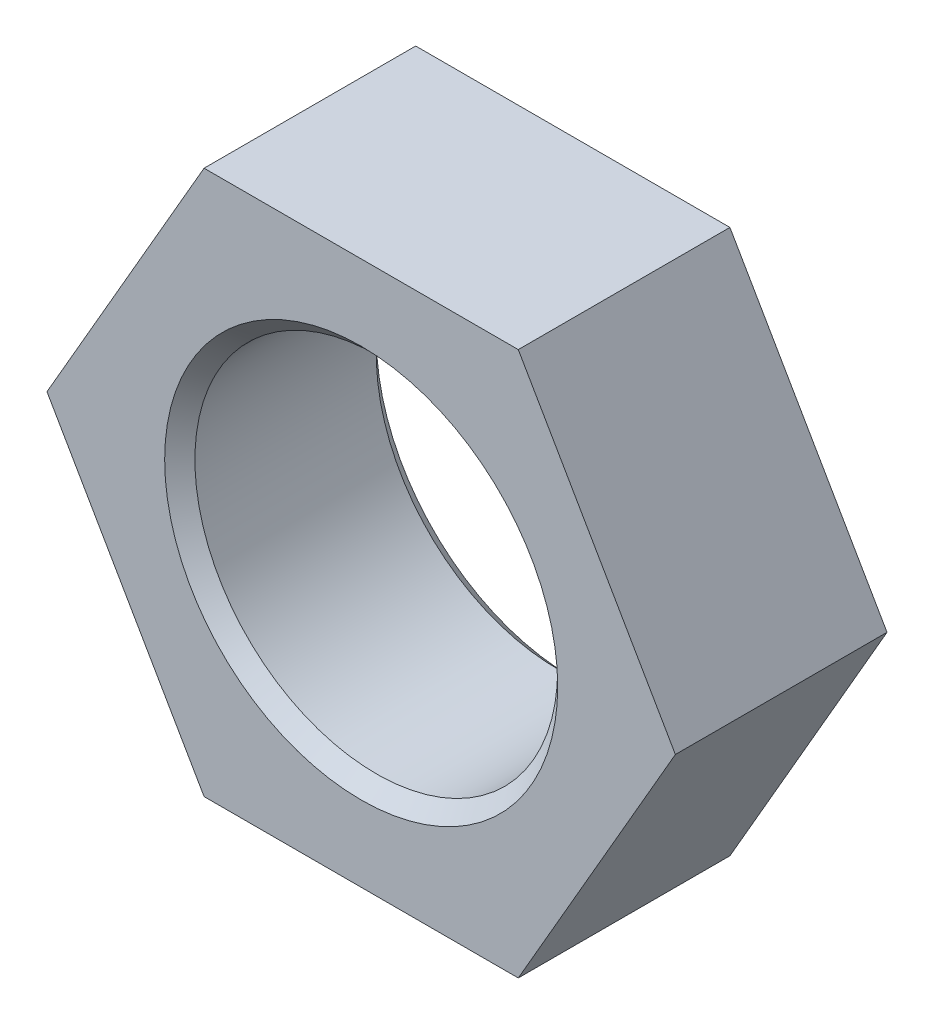
ISO-10303-21;
HEADER;
FILE_DESCRIPTION(('STEP AP214'),'2;1');
FILE_NAME('part.step','',(''),(''),'','','');
FILE_SCHEMA(('AUTOMOTIVE_DESIGN { 1 0 10303 214 1 1 1 1 }'));
ENDSEC;
DATA;
#1=APPLICATION_CONTEXT('core data for automotive mechanical design processes');
#2=APPLICATION_PROTOCOL_DEFINITION('international standard','automotive_design',2000,#1);
#3=PRODUCT_CONTEXT('',#1,'mechanical');
#4=PRODUCT('Part','Part','',(#3));
#5=PRODUCT_RELATED_PRODUCT_CATEGORY('part','',(#4));
#6=PRODUCT_DEFINITION_FORMATION('','',#4);
#7=PRODUCT_DEFINITION_CONTEXT('part definition',#1,'design');
#8=PRODUCT_DEFINITION('design','',#6,#7);
#9=PRODUCT_DEFINITION_SHAPE('','',#8);
#10=(LENGTH_UNIT() NAMED_UNIT(*) SI_UNIT(.MILLI.,.METRE.));
#11=(NAMED_UNIT(*) PLANE_ANGLE_UNIT() SI_UNIT($,.RADIAN.));
#12=(NAMED_UNIT(*) SI_UNIT($,.STERADIAN.) SOLID_ANGLE_UNIT());
#13=UNCERTAINTY_MEASURE_WITH_UNIT(LENGTH_MEASURE(1.E-05),#10,'distance_accuracy_value','');
#14=(GEOMETRIC_REPRESENTATION_CONTEXT(3) GLOBAL_UNCERTAINTY_ASSIGNED_CONTEXT((#13)) GLOBAL_UNIT_ASSIGNED_CONTEXT((#10,
#11,#12)) REPRESENTATION_CONTEXT('',''));
#15=CARTESIAN_POINT('',(0.,0.,0.));
#16=DIRECTION('',(0.,0.,1.));
#17=DIRECTION('',(1.,0.,0.));
#18=AXIS2_PLACEMENT_3D('',#15,#16,#17);
#19=CARTESIAN_POINT('',(0.,0.,3.5));
#20=DIRECTION('',(0.,0.,1.));
#21=DIRECTION('',(1.,0.,0.));
#22=AXIS2_PLACEMENT_3D('',#19,#20,#21);
#23=PLANE('',#22);
#24=CARTESIAN_POINT('',(0.,0.,3.5));
#25=DIRECTION('',(0.,0.,1.));
#26=DIRECTION('',(1.,0.,0.));
#27=AXIS2_PLACEMENT_3D('',#24,#25,#26);
#28=CIRCLE('',#27,3.25);
#29=CARTESIAN_POINT('',(3.25,0.,3.5));
#30=VERTEX_POINT('',#29);
#31=EDGE_CURVE('E11',#30,#30,#28,.F.);
#32=ORIENTED_EDGE('',*,*,#31,.T.);
#33=EDGE_LOOP('',(#32));
#34=FACE_BOUND('',#33,.T.);
#35=DIRECTION('',(0.499999999999999,0.866025403784439,0.));
#36=VECTOR('',#35,1.);
#37=CARTESIAN_POINT('',(2.59807621135332,-4.5,3.5));
#38=LINE('',#37,#36);
#39=CARTESIAN_POINT('',(2.59807621135332,-4.5,3.5));
#40=VERTEX_POINT('',#39);
#41=CARTESIAN_POINT('',(5.19615242270663,0.,3.5));
#42=VERTEX_POINT('',#41);
#43=EDGE_CURVE('E132',#40,#42,#38,.T.);
#44=ORIENTED_EDGE('',*,*,#43,.T.);
#45=DIRECTION('',(-0.5,0.866025403784438,0.));
#46=VECTOR('',#45,1.);
#47=CARTESIAN_POINT('',(5.19615242270663,0.,3.5));
#48=LINE('',#47,#46);
#49=CARTESIAN_POINT('',(2.59807621135332,4.5,3.5));
#50=VERTEX_POINT('',#49);
#51=EDGE_CURVE('E92',#42,#50,#48,.T.);
#52=ORIENTED_EDGE('',*,*,#51,.T.);
#53=DIRECTION('',(-1.,0.,0.));
#54=VECTOR('',#53,1.);
#55=CARTESIAN_POINT('',(2.59807621135332,4.5,3.5));
#56=LINE('',#55,#54);
#57=CARTESIAN_POINT('',(-2.59807621135332,4.5,3.5));
#58=VERTEX_POINT('',#57);
#59=EDGE_CURVE('E104',#50,#58,#56,.T.);
#60=ORIENTED_EDGE('',*,*,#59,.T.);
#61=DIRECTION('',(-0.5,-0.866025403784439,0.));
#62=VECTOR('',#61,1.);
#63=CARTESIAN_POINT('',(-2.59807621135332,4.5,3.5));
#64=LINE('',#63,#62);
#65=CARTESIAN_POINT('',(-5.19615242270663,0.,3.5));
#66=VERTEX_POINT('',#65);
#67=EDGE_CURVE('E99',#58,#66,#64,.T.);
#68=ORIENTED_EDGE('',*,*,#67,.T.);
#69=DIRECTION('',(0.5,-0.866025403784438,0.));
#70=VECTOR('',#69,1.);
#71=CARTESIAN_POINT('',(-5.19615242270663,0.,3.5));
#72=LINE('',#71,#70);
#73=CARTESIAN_POINT('',(-2.59807621135332,-4.5,3.5));
#74=VERTEX_POINT('',#73);
#75=EDGE_CURVE('E102',#66,#74,#72,.T.);
#76=ORIENTED_EDGE('',*,*,#75,.T.);
#77=DIRECTION('',(1.,0.,0.));
#78=VECTOR('',#77,1.);
#79=CARTESIAN_POINT('',(-2.59807621135332,-4.5,3.5));
#80=LINE('',#79,#78);
#81=EDGE_CURVE('E54',#74,#40,#80,.T.);
#82=ORIENTED_EDGE('',*,*,#81,.T.);
#83=EDGE_LOOP('',(#44,#52,#60,#68,#76,#82));
#84=FACE_BOUND('',#83,.T.);
#85=ADVANCED_FACE('F36',(#34,#84),#23,.T.);
#86=CARTESIAN_POINT('',(0.,0.,0.));
#87=DIRECTION('',(0.,0.,1.));
#88=DIRECTION('',(1.,0.,0.));
#89=AXIS2_PLACEMENT_3D('',#86,#87,#88);
#90=PLANE('',#89);
#91=CARTESIAN_POINT('',(0.,0.,0.));
#92=DIRECTION('',(0.,0.,1.));
#93=DIRECTION('',(1.,0.,0.));
#94=AXIS2_PLACEMENT_3D('',#91,#92,#93);
#95=CIRCLE('',#94,3.25);
#96=CARTESIAN_POINT('',(3.25,0.,0.));
#97=VERTEX_POINT('',#96);
#98=EDGE_CURVE('E141',#97,#97,#95,.T.);
#99=ORIENTED_EDGE('',*,*,#98,.T.);
#100=EDGE_LOOP('',(#99));
#101=FACE_BOUND('',#100,.T.);
#102=DIRECTION('',(0.499999999999999,0.866025403784439,0.));
#103=VECTOR('',#102,1.);
#104=CARTESIAN_POINT('',(2.59807621135332,-4.5,0.));
#105=LINE('',#104,#103);
#106=CARTESIAN_POINT('',(2.59807621135332,-4.5,0.));
#107=VERTEX_POINT('',#106);
#108=CARTESIAN_POINT('',(5.19615242270663,0.,0.));
#109=VERTEX_POINT('',#108);
#110=EDGE_CURVE('E122',#107,#109,#105,.T.);
#111=ORIENTED_EDGE('',*,*,#110,.F.);
#112=DIRECTION('',(1.,0.,0.));
#113=VECTOR('',#112,1.);
#114=CARTESIAN_POINT('',(-2.59807621135332,-4.5,0.));
#115=LINE('',#114,#113);
#116=CARTESIAN_POINT('',(-2.59807621135332,-4.5,0.));
#117=VERTEX_POINT('',#116);
#118=EDGE_CURVE('E83',#117,#107,#115,.T.);
#119=ORIENTED_EDGE('',*,*,#118,.F.);
#120=DIRECTION('',(0.5,-0.866025403784438,0.));
#121=VECTOR('',#120,1.);
#122=CARTESIAN_POINT('',(-5.19615242270663,0.,0.));
#123=LINE('',#122,#121);
#124=CARTESIAN_POINT('',(-5.19615242270663,0.,0.));
#125=VERTEX_POINT('',#124);
#126=EDGE_CURVE('E77',#125,#117,#123,.T.);
#127=ORIENTED_EDGE('',*,*,#126,.F.);
#128=DIRECTION('',(-0.5,-0.866025403784439,0.));
#129=VECTOR('',#128,1.);
#130=CARTESIAN_POINT('',(-2.59807621135332,4.5,0.));
#131=LINE('',#130,#129);
#132=CARTESIAN_POINT('',(-2.59807621135332,4.5,0.));
#133=VERTEX_POINT('',#132);
#134=EDGE_CURVE('E112',#133,#125,#131,.T.);
#135=ORIENTED_EDGE('',*,*,#134,.F.);
#136=DIRECTION('',(-1.,0.,0.));
#137=VECTOR('',#136,1.);
#138=CARTESIAN_POINT('',(2.59807621135332,4.5,0.));
#139=LINE('',#138,#137);
#140=CARTESIAN_POINT('',(2.59807621135332,4.5,0.));
#141=VERTEX_POINT('',#140);
#142=EDGE_CURVE('E127',#141,#133,#139,.T.);
#143=ORIENTED_EDGE('',*,*,#142,.F.);
#144=DIRECTION('',(-0.5,0.866025403784438,0.));
#145=VECTOR('',#144,1.);
#146=CARTESIAN_POINT('',(5.19615242270663,0.,0.));
#147=LINE('',#146,#145);
#148=EDGE_CURVE('E125',#109,#141,#147,.T.);
#149=ORIENTED_EDGE('',*,*,#148,.F.);
#150=EDGE_LOOP('',(#111,#119,#127,#135,#143,#149));
#151=FACE_BOUND('',#150,.T.);
#152=ADVANCED_FACE('F157',(#101,#151),#90,.F.);
#153=CARTESIAN_POINT('',(2.59807621135332,-4.5,3.5));
#154=DIRECTION('',(-0.866025403784439,0.499999999999999,0.));
#155=DIRECTION('',(-0.5,-0.866025403784439,0.));
#156=AXIS2_PLACEMENT_3D('',#153,#154,#155);
#157=PLANE('',#156);
#158=ORIENTED_EDGE('',*,*,#110,.T.);
#159=DIRECTION('',(0.,0.,-1.));
#160=VECTOR('',#159,1.);
#161=CARTESIAN_POINT('',(5.19615242270663,0.,3.5));
#162=LINE('',#161,#160);
#163=EDGE_CURVE('E139',#42,#109,#162,.T.);
#164=ORIENTED_EDGE('',*,*,#163,.F.);
#165=ORIENTED_EDGE('',*,*,#43,.F.);
#166=DIRECTION('',(0.,0.,-1.));
#167=VECTOR('',#166,1.);
#168=CARTESIAN_POINT('',(2.59807621135332,-4.5,3.5));
#169=LINE('',#168,#167);
#170=EDGE_CURVE('E118',#40,#107,#169,.T.);
#171=ORIENTED_EDGE('',*,*,#170,.T.);
#172=EDGE_LOOP('',(#158,#164,#165,#171));
#173=FACE_BOUND('',#172,.T.);
#174=ADVANCED_FACE('F160',(#173),#157,.F.);
#175=CARTESIAN_POINT('',(5.19615242270663,0.,3.5));
#176=DIRECTION('',(-0.866025403784438,-0.5,0.));
#177=DIRECTION('',(0.5,-0.866025403784439,0.));
#178=AXIS2_PLACEMENT_3D('',#175,#176,#177);
#179=PLANE('',#178);
#180=ORIENTED_EDGE('',*,*,#148,.T.);
#181=DIRECTION('',(0.,0.,-1.));
#182=VECTOR('',#181,1.);
#183=CARTESIAN_POINT('',(2.59807621135332,4.5,3.5));
#184=LINE('',#183,#182);
#185=EDGE_CURVE('E136',#50,#141,#184,.T.);
#186=ORIENTED_EDGE('',*,*,#185,.F.);
#187=ORIENTED_EDGE('',*,*,#51,.F.);
#188=ORIENTED_EDGE('',*,*,#163,.T.);
#189=EDGE_LOOP('',(#180,#186,#187,#188));
#190=FACE_BOUND('',#189,.T.);
#191=ADVANCED_FACE('F236',(#190),#179,.F.);
#192=CARTESIAN_POINT('',(2.59807621135332,4.5,3.5));
#193=DIRECTION('',(0.,-1.,0.));
#194=DIRECTION('',(0.,0.,-1.));
#195=AXIS2_PLACEMENT_3D('',#192,#193,#194);
#196=PLANE('',#195);
#197=ORIENTED_EDGE('',*,*,#142,.T.);
#198=DIRECTION('',(0.,0.,-1.));
#199=VECTOR('',#198,1.);
#200=CARTESIAN_POINT('',(-2.59807621135332,4.5,3.5));
#201=LINE('',#200,#199);
#202=EDGE_CURVE('E113',#58,#133,#201,.T.);
#203=ORIENTED_EDGE('',*,*,#202,.F.);
#204=ORIENTED_EDGE('',*,*,#59,.F.);
#205=ORIENTED_EDGE('',*,*,#185,.T.);
#206=EDGE_LOOP('',(#197,#203,#204,#205));
#207=FACE_BOUND('',#206,.T.);
#208=ADVANCED_FACE('F227',(#207),#196,.F.);
#209=CARTESIAN_POINT('',(-2.59807621135332,4.5,3.5));
#210=DIRECTION('',(0.866025403784439,-0.5,0.));
#211=DIRECTION('',(0.5,0.866025403784439,0.));
#212=AXIS2_PLACEMENT_3D('',#209,#210,#211);
#213=PLANE('',#212);
#214=ORIENTED_EDGE('',*,*,#134,.T.);
#215=DIRECTION('',(0.,0.,-1.));
#216=VECTOR('',#215,1.);
#217=CARTESIAN_POINT('',(-5.19615242270663,0.,3.5));
#218=LINE('',#217,#216);
#219=EDGE_CURVE('E109',#66,#125,#218,.T.);
#220=ORIENTED_EDGE('',*,*,#219,.F.);
#221=ORIENTED_EDGE('',*,*,#67,.F.);
#222=ORIENTED_EDGE('',*,*,#202,.T.);
#223=EDGE_LOOP('',(#214,#220,#221,#222));
#224=FACE_BOUND('',#223,.T.);
#225=ADVANCED_FACE('F110',(#224),#213,.F.);
#226=CARTESIAN_POINT('',(-5.19615242270663,0.,3.5));
#227=DIRECTION('',(0.866025403784438,0.5,0.));
#228=DIRECTION('',(-0.5,0.866025403784438,0.));
#229=AXIS2_PLACEMENT_3D('',#226,#227,#228);
#230=PLANE('',#229);
#231=ORIENTED_EDGE('',*,*,#126,.T.);
#232=DIRECTION('',(0.,0.,-1.));
#233=VECTOR('',#232,1.);
#234=CARTESIAN_POINT('',(-2.59807621135332,-4.5,3.5));
#235=LINE('',#234,#233);
#236=EDGE_CURVE('E114',#74,#117,#235,.T.);
#237=ORIENTED_EDGE('',*,*,#236,.F.);
#238=ORIENTED_EDGE('',*,*,#75,.F.);
#239=ORIENTED_EDGE('',*,*,#219,.T.);
#240=EDGE_LOOP('',(#231,#237,#238,#239));
#241=FACE_BOUND('',#240,.T.);
#242=ADVANCED_FACE('F116',(#241),#230,.F.);
#243=CARTESIAN_POINT('',(-2.59807621135332,-4.5,3.5));
#244=DIRECTION('',(0.,1.,0.));
#245=DIRECTION('',(0.,0.,1.));
#246=AXIS2_PLACEMENT_3D('',#243,#244,#245);
#247=PLANE('',#246);
#248=ORIENTED_EDGE('',*,*,#118,.T.);
#249=ORIENTED_EDGE('',*,*,#170,.F.);
#250=ORIENTED_EDGE('',*,*,#81,.F.);
#251=ORIENTED_EDGE('',*,*,#236,.T.);
#252=EDGE_LOOP('',(#248,#249,#250,#251));
#253=FACE_BOUND('',#252,.T.);
#254=ADVANCED_FACE('F167',(#253),#247,.F.);
#255=CARTESIAN_POINT('',(0.,0.,3.5));
#256=DIRECTION('',(0.,0.,-1.));
#257=DIRECTION('',(-1.,0.,0.));
#258=AXIS2_PLACEMENT_3D('',#255,#256,#257);
#259=CYLINDRICAL_SURFACE('',#258,3.);
#260=CARTESIAN_POINT('',(0.,0.,0.250000000000001));
#261=DIRECTION('',(0.,0.,1.));
#262=DIRECTION('',(1.,0.,0.));
#263=AXIS2_PLACEMENT_3D('',#260,#261,#262);
#264=CIRCLE('',#263,3.);
#265=CARTESIAN_POINT('',(3.,0.,0.250000000000001));
#266=VERTEX_POINT('',#265);
#267=EDGE_CURVE('E46',#266,#266,#264,.F.);
#268=ORIENTED_EDGE('',*,*,#267,.T.);
#269=EDGE_LOOP('',(#268));
#270=FACE_BOUND('',#269,.T.);
#271=CARTESIAN_POINT('',(0.,0.,3.25));
#272=DIRECTION('',(0.,0.,1.));
#273=DIRECTION('',(1.,0.,0.));
#274=AXIS2_PLACEMENT_3D('',#271,#272,#273);
#275=CIRCLE('',#274,3.);
#276=CARTESIAN_POINT('',(3.,0.,3.25));
#277=VERTEX_POINT('',#276);
#278=EDGE_CURVE('E144',#277,#277,#275,.T.);
#279=ORIENTED_EDGE('',*,*,#278,.T.);
#280=EDGE_LOOP('',(#279));
#281=FACE_BOUND('',#280,.T.);
#282=ADVANCED_FACE('F149',(#270,#281),#259,.F.);
#283=CARTESIAN_POINT('',(0.,0.,0.));
#284=DIRECTION('',(0.,0.,-1.));
#285=DIRECTION('',(-1.,0.,0.));
#286=AXIS2_PLACEMENT_3D('',#283,#284,#285);
#287=CONICAL_SURFACE('',#286,3.25,0.785398163397445);
#288=ORIENTED_EDGE('',*,*,#267,.F.);
#289=EDGE_LOOP('',(#288));
#290=FACE_BOUND('',#289,.T.);
#291=ORIENTED_EDGE('',*,*,#98,.F.);
#292=EDGE_LOOP('',(#291));
#293=FACE_BOUND('',#292,.T.);
#294=ADVANCED_FACE('F152',(#290,#293),#287,.F.);
#295=CARTESIAN_POINT('',(0.,0.,3.25));
#296=DIRECTION('',(0.,0.,1.));
#297=DIRECTION('',(1.,0.,0.));
#298=AXIS2_PLACEMENT_3D('',#295,#296,#297);
#299=CONICAL_SURFACE('',#298,3.,0.785398163397448);
#300=ORIENTED_EDGE('',*,*,#31,.F.);
#301=EDGE_LOOP('',(#300));
#302=FACE_BOUND('',#301,.T.);
#303=ORIENTED_EDGE('',*,*,#278,.F.);
#304=EDGE_LOOP('',(#303));
#305=FACE_BOUND('',#304,.T.);
#306=ADVANCED_FACE('F39',(#302,#305),#299,.F.);
#307=CLOSED_SHELL('',(#85,#152,#174,#191,#208,#225,#242,#254,#282,#294,#306));
#308=MANIFOLD_SOLID_BREP('B2',#307);
#309=ADVANCED_BREP_SHAPE_REPRESENTATION('',(#18,#308),#14);
#310=SHAPE_DEFINITION_REPRESENTATION(#9,#309);
ENDSEC;
END-ISO-10303-21;
